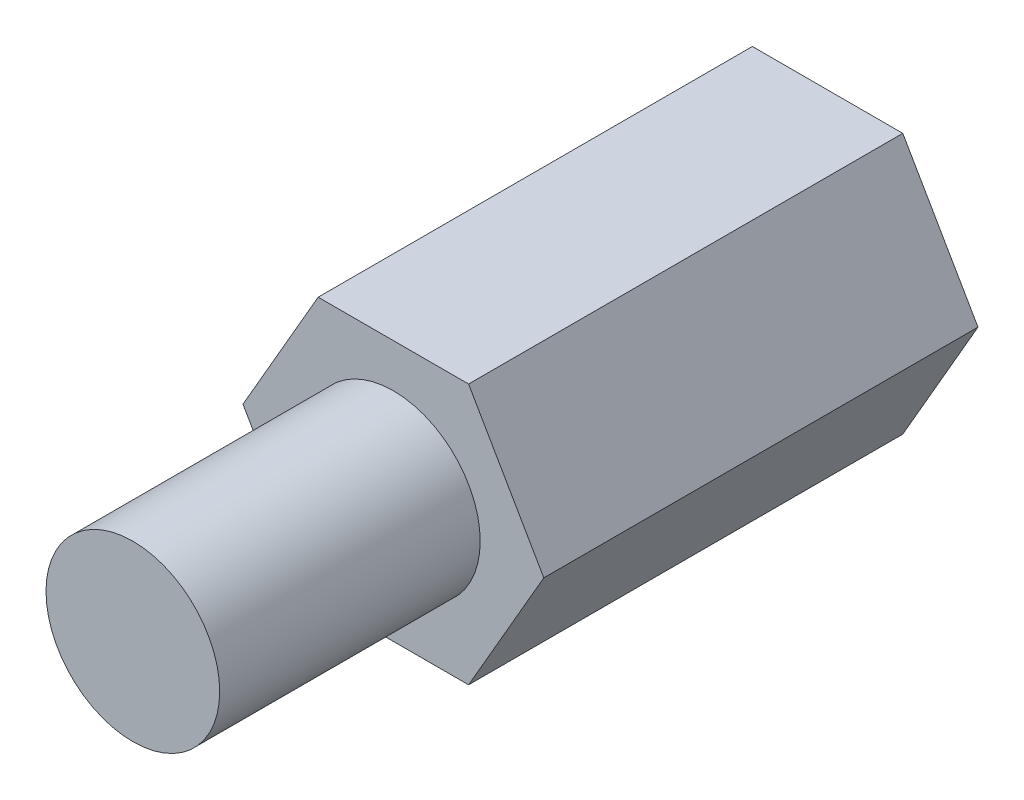
ISO-10303-21;
HEADER;
FILE_DESCRIPTION(('STEP AP214'),'2;1');
FILE_NAME('part.step','',(''),(''),'','','');
FILE_SCHEMA(('AUTOMOTIVE_DESIGN { 1 0 10303 214 1 1 1 1 }'));
ENDSEC;
DATA;
#1=APPLICATION_CONTEXT('core data for automotive mechanical design processes');
#2=APPLICATION_PROTOCOL_DEFINITION('international standard','automotive_design',2000,#1);
#3=PRODUCT_CONTEXT('',#1,'mechanical');
#4=PRODUCT('Part','Part','',(#3));
#5=PRODUCT_RELATED_PRODUCT_CATEGORY('part','',(#4));
#6=PRODUCT_DEFINITION_FORMATION('','',#4);
#7=PRODUCT_DEFINITION_CONTEXT('part definition',#1,'design');
#8=PRODUCT_DEFINITION('design','',#6,#7);
#9=PRODUCT_DEFINITION_SHAPE('','',#8);
#10=(LENGTH_UNIT() NAMED_UNIT(*) SI_UNIT(.MILLI.,.METRE.));
#11=(NAMED_UNIT(*) PLANE_ANGLE_UNIT() SI_UNIT($,.RADIAN.));
#12=(NAMED_UNIT(*) SI_UNIT($,.STERADIAN.) SOLID_ANGLE_UNIT());
#13=UNCERTAINTY_MEASURE_WITH_UNIT(LENGTH_MEASURE(1.E-05),#10,'distance_accuracy_value','');
#14=(GEOMETRIC_REPRESENTATION_CONTEXT(3) GLOBAL_UNCERTAINTY_ASSIGNED_CONTEXT((#13)) GLOBAL_UNIT_ASSIGNED_CONTEXT((#10,
#11,#12)) REPRESENTATION_CONTEXT('',''));
#15=CARTESIAN_POINT('',(0.,0.,0.));
#16=DIRECTION('',(0.,0.,1.));
#17=DIRECTION('',(1.,0.,0.));
#18=AXIS2_PLACEMENT_3D('',#15,#16,#17);
#19=CARTESIAN_POINT('',(-0.866025403784438,-1.5,5.));
#20=DIRECTION('',(0.,1.,0.));
#21=DIRECTION('',(-1.,0.,0.));
#22=AXIS2_PLACEMENT_3D('',#19,#20,#21);
#23=PLANE('',#22);
#24=DIRECTION('',(1.,0.,0.));
#25=VECTOR('',#24,1.);
#26=CARTESIAN_POINT('',(-0.866025403784438,-1.5,0.));
#27=LINE('',#26,#25);
#28=CARTESIAN_POINT('',(-0.866025403784438,-1.5,0.));
#29=VERTEX_POINT('',#28);
#30=CARTESIAN_POINT('',(0.866025403784439,-1.5,0.));
#31=VERTEX_POINT('',#30);
#32=EDGE_CURVE('E121',#29,#31,#27,.T.);
#33=ORIENTED_EDGE('',*,*,#32,.T.);
#34=DIRECTION('',(0.,0.,-1.));
#35=VECTOR('',#34,1.);
#36=CARTESIAN_POINT('',(0.866025403784439,-1.5,5.));
#37=LINE('',#36,#35);
#38=CARTESIAN_POINT('',(0.866025403784439,-1.5,5.));
#39=VERTEX_POINT('',#38);
#40=EDGE_CURVE('E36',#39,#31,#37,.T.);
#41=ORIENTED_EDGE('',*,*,#40,.F.);
#42=DIRECTION('',(1.,0.,0.));
#43=VECTOR('',#42,1.);
#44=CARTESIAN_POINT('',(-0.866025403784438,-1.5,5.));
#45=LINE('',#44,#43);
#46=CARTESIAN_POINT('',(-0.866025403784438,-1.5,5.));
#47=VERTEX_POINT('',#46);
#48=EDGE_CURVE('E132',#47,#39,#45,.T.);
#49=ORIENTED_EDGE('',*,*,#48,.F.);
#50=DIRECTION('',(0.,0.,-1.));
#51=VECTOR('',#50,1.);
#52=CARTESIAN_POINT('',(-0.866025403784438,-1.5,5.));
#53=LINE('',#52,#51);
#54=EDGE_CURVE('E117',#47,#29,#53,.T.);
#55=ORIENTED_EDGE('',*,*,#54,.T.);
#56=EDGE_LOOP('',(#33,#41,#49,#55));
#57=FACE_BOUND('',#56,.T.);
#58=ADVANCED_FACE('F33',(#57),#23,.F.);
#59=CARTESIAN_POINT('',(0.866025403784439,-1.5,5.));
#60=DIRECTION('',(-0.866025403784439,0.5,0.));
#61=DIRECTION('',(-0.5,-0.866025403784439,0.));
#62=AXIS2_PLACEMENT_3D('',#59,#60,#61);
#63=PLANE('',#62);
#64=DIRECTION('',(0.5,0.866025403784439,0.));
#65=VECTOR('',#64,1.);
#66=CARTESIAN_POINT('',(0.866025403784439,-1.5,0.));
#67=LINE('',#66,#65);
#68=CARTESIAN_POINT('',(1.73205080756888,0.,0.));
#69=VERTEX_POINT('',#68);
#70=EDGE_CURVE('E124',#31,#69,#67,.T.);
#71=ORIENTED_EDGE('',*,*,#70,.T.);
#72=DIRECTION('',(0.,0.,-1.));
#73=VECTOR('',#72,1.);
#74=CARTESIAN_POINT('',(1.73205080756888,0.,5.));
#75=LINE('',#74,#73);
#76=CARTESIAN_POINT('',(1.73205080756888,0.,5.));
#77=VERTEX_POINT('',#76);
#78=EDGE_CURVE('E135',#77,#69,#75,.T.);
#79=ORIENTED_EDGE('',*,*,#78,.F.);
#80=DIRECTION('',(0.5,0.866025403784439,0.));
#81=VECTOR('',#80,1.);
#82=CARTESIAN_POINT('',(0.866025403784439,-1.5,5.));
#83=LINE('',#82,#81);
#84=EDGE_CURVE('E89',#39,#77,#83,.T.);
#85=ORIENTED_EDGE('',*,*,#84,.F.);
#86=ORIENTED_EDGE('',*,*,#40,.T.);
#87=EDGE_LOOP('',(#71,#79,#85,#86));
#88=FACE_BOUND('',#87,.T.);
#89=ADVANCED_FACE('F140',(#88),#63,.F.);
#90=CARTESIAN_POINT('',(1.73205080756888,0.,5.));
#91=DIRECTION('',(-0.866025403784439,-0.5,0.));
#92=DIRECTION('',(0.5,-0.866025403784439,0.));
#93=AXIS2_PLACEMENT_3D('',#90,#91,#92);
#94=PLANE('',#93);
#95=DIRECTION('',(-0.5,0.866025403784439,0.));
#96=VECTOR('',#95,1.);
#97=CARTESIAN_POINT('',(1.73205080756888,0.,0.));
#98=LINE('',#97,#96);
#99=CARTESIAN_POINT('',(0.866025403784439,1.5,0.));
#100=VERTEX_POINT('',#99);
#101=EDGE_CURVE('E127',#69,#100,#98,.T.);
#102=ORIENTED_EDGE('',*,*,#101,.T.);
#103=DIRECTION('',(0.,0.,-1.));
#104=VECTOR('',#103,1.);
#105=CARTESIAN_POINT('',(0.866025403784439,1.5,5.));
#106=LINE('',#105,#104);
#107=CARTESIAN_POINT('',(0.866025403784439,1.5,5.));
#108=VERTEX_POINT('',#107);
#109=EDGE_CURVE('E112',#108,#100,#106,.T.);
#110=ORIENTED_EDGE('',*,*,#109,.F.);
#111=DIRECTION('',(-0.5,0.866025403784439,0.));
#112=VECTOR('',#111,1.);
#113=CARTESIAN_POINT('',(1.73205080756888,0.,5.));
#114=LINE('',#113,#112);
#115=EDGE_CURVE('E103',#77,#108,#114,.T.);
#116=ORIENTED_EDGE('',*,*,#115,.F.);
#117=ORIENTED_EDGE('',*,*,#78,.T.);
#118=EDGE_LOOP('',(#102,#110,#116,#117));
#119=FACE_BOUND('',#118,.T.);
#120=ADVANCED_FACE('F146',(#119),#94,.F.);
#121=CARTESIAN_POINT('',(0.866025403784439,1.5,5.));
#122=DIRECTION('',(0.,-1.,0.));
#123=DIRECTION('',(0.,0.,-1.));
#124=AXIS2_PLACEMENT_3D('',#121,#122,#123);
#125=PLANE('',#124);
#126=DIRECTION('',(-1.,0.,0.));
#127=VECTOR('',#126,1.);
#128=CARTESIAN_POINT('',(0.866025403784439,1.5,0.));
#129=LINE('',#128,#127);
#130=CARTESIAN_POINT('',(-0.866025403784439,1.5,0.));
#131=VERTEX_POINT('',#130);
#132=EDGE_CURVE('E111',#100,#131,#129,.T.);
#133=ORIENTED_EDGE('',*,*,#132,.T.);
#134=DIRECTION('',(0.,0.,-1.));
#135=VECTOR('',#134,1.);
#136=CARTESIAN_POINT('',(-0.866025403784439,1.5,5.));
#137=LINE('',#136,#135);
#138=CARTESIAN_POINT('',(-0.866025403784439,1.5,5.));
#139=VERTEX_POINT('',#138);
#140=EDGE_CURVE('E108',#139,#131,#137,.T.);
#141=ORIENTED_EDGE('',*,*,#140,.F.);
#142=DIRECTION('',(-1.,0.,0.));
#143=VECTOR('',#142,1.);
#144=CARTESIAN_POINT('',(0.866025403784439,1.5,5.));
#145=LINE('',#144,#143);
#146=EDGE_CURVE('E97',#108,#139,#145,.T.);
#147=ORIENTED_EDGE('',*,*,#146,.F.);
#148=ORIENTED_EDGE('',*,*,#109,.T.);
#149=EDGE_LOOP('',(#133,#141,#147,#148));
#150=FACE_BOUND('',#149,.T.);
#151=ADVANCED_FACE('F109',(#150),#125,.F.);
#152=CARTESIAN_POINT('',(-0.866025403784439,1.5,5.));
#153=DIRECTION('',(0.866025403784439,-0.5,0.));
#154=DIRECTION('',(0.5,0.866025403784439,0.));
#155=AXIS2_PLACEMENT_3D('',#152,#153,#154);
#156=PLANE('',#155);
#157=DIRECTION('',(-0.5,-0.866025403784439,0.));
#158=VECTOR('',#157,1.);
#159=CARTESIAN_POINT('',(-0.866025403784439,1.5,0.));
#160=LINE('',#159,#158);
#161=CARTESIAN_POINT('',(-1.73205080756888,0.,0.));
#162=VERTEX_POINT('',#161);
#163=EDGE_CURVE('E74',#131,#162,#160,.T.);
#164=ORIENTED_EDGE('',*,*,#163,.T.);
#165=DIRECTION('',(0.,0.,-1.));
#166=VECTOR('',#165,1.);
#167=CARTESIAN_POINT('',(-1.73205080756888,0.,5.));
#168=LINE('',#167,#166);
#169=CARTESIAN_POINT('',(-1.73205080756888,0.,5.));
#170=VERTEX_POINT('',#169);
#171=EDGE_CURVE('E113',#170,#162,#168,.T.);
#172=ORIENTED_EDGE('',*,*,#171,.F.);
#173=DIRECTION('',(-0.5,-0.866025403784439,0.));
#174=VECTOR('',#173,1.);
#175=CARTESIAN_POINT('',(-0.866025403784439,1.5,5.));
#176=LINE('',#175,#174);
#177=EDGE_CURVE('E101',#139,#170,#176,.T.);
#178=ORIENTED_EDGE('',*,*,#177,.F.);
#179=ORIENTED_EDGE('',*,*,#140,.T.);
#180=EDGE_LOOP('',(#164,#172,#178,#179));
#181=FACE_BOUND('',#180,.T.);
#182=ADVANCED_FACE('F115',(#181),#156,.F.);
#183=CARTESIAN_POINT('',(-1.73205080756888,0.,5.));
#184=DIRECTION('',(0.866025403784439,0.5,0.));
#185=DIRECTION('',(-0.5,0.866025403784439,0.));
#186=AXIS2_PLACEMENT_3D('',#183,#184,#185);
#187=PLANE('',#186);
#188=DIRECTION('',(0.5,-0.866025403784439,0.));
#189=VECTOR('',#188,1.);
#190=CARTESIAN_POINT('',(-1.73205080756888,0.,0.));
#191=LINE('',#190,#189);
#192=EDGE_CURVE('E80',#162,#29,#191,.T.);
#193=ORIENTED_EDGE('',*,*,#192,.T.);
#194=ORIENTED_EDGE('',*,*,#54,.F.);
#195=DIRECTION('',(0.5,-0.866025403784439,0.));
#196=VECTOR('',#195,1.);
#197=CARTESIAN_POINT('',(-1.73205080756888,0.,5.));
#198=LINE('',#197,#196);
#199=EDGE_CURVE('E50',#170,#47,#198,.T.);
#200=ORIENTED_EDGE('',*,*,#199,.F.);
#201=ORIENTED_EDGE('',*,*,#171,.T.);
#202=EDGE_LOOP('',(#193,#194,#200,#201));
#203=FACE_BOUND('',#202,.T.);
#204=ADVANCED_FACE('F171',(#203),#187,.F.);
#205=CARTESIAN_POINT('',(0.,0.,5.));
#206=DIRECTION('',(0.,0.,1.));
#207=DIRECTION('',(1.,0.,0.));
#208=AXIS2_PLACEMENT_3D('',#205,#206,#207);
#209=PLANE('',#208);
#210=CARTESIAN_POINT('',(0.,0.,5.));
#211=DIRECTION('',(0.,0.,1.));
#212=DIRECTION('',(1.,0.,0.));
#213=AXIS2_PLACEMENT_3D('',#210,#211,#212);
#214=CIRCLE('',#213,1.);
#215=CARTESIAN_POINT('',(1.,0.,5.));
#216=VERTEX_POINT('',#215);
#217=EDGE_CURVE('E11',#216,#216,#214,.T.);
#218=ORIENTED_EDGE('',*,*,#217,.F.);
#219=EDGE_LOOP('',(#218));
#220=FACE_BOUND('',#219,.T.);
#221=ORIENTED_EDGE('',*,*,#48,.T.);
#222=ORIENTED_EDGE('',*,*,#84,.T.);
#223=ORIENTED_EDGE('',*,*,#115,.T.);
#224=ORIENTED_EDGE('',*,*,#146,.T.);
#225=ORIENTED_EDGE('',*,*,#177,.T.);
#226=ORIENTED_EDGE('',*,*,#199,.T.);
#227=EDGE_LOOP('',(#221,#222,#223,#224,#225,#226));
#228=FACE_BOUND('',#227,.T.);
#229=ADVANCED_FACE('F99',(#220,#228),#209,.T.);
#230=CARTESIAN_POINT('',(0.,0.,0.));
#231=DIRECTION('',(0.,0.,1.));
#232=DIRECTION('',(1.,0.,0.));
#233=AXIS2_PLACEMENT_3D('',#230,#231,#232);
#234=PLANE('',#233);
#235=CARTESIAN_POINT('',(0.,0.,0.));
#236=DIRECTION('',(0.,0.,-1.));
#237=DIRECTION('',(-1.,0.,0.));
#238=AXIS2_PLACEMENT_3D('',#235,#236,#237);
#239=CIRCLE('',#238,1.19999999999999);
#240=CARTESIAN_POINT('',(-1.19999999999999,0.,0.));
#241=VERTEX_POINT('',#240);
#242=EDGE_CURVE('E155',#241,#241,#239,.T.);
#243=ORIENTED_EDGE('',*,*,#242,.F.);
#244=EDGE_LOOP('',(#243));
#245=FACE_BOUND('',#244,.T.);
#246=ORIENTED_EDGE('',*,*,#32,.F.);
#247=ORIENTED_EDGE('',*,*,#192,.F.);
#248=ORIENTED_EDGE('',*,*,#163,.F.);
#249=ORIENTED_EDGE('',*,*,#132,.F.);
#250=ORIENTED_EDGE('',*,*,#101,.F.);
#251=ORIENTED_EDGE('',*,*,#70,.F.);
#252=EDGE_LOOP('',(#246,#247,#248,#249,#250,#251));
#253=FACE_BOUND('',#252,.T.);
#254=ADVANCED_FACE('F145',(#245,#253),#234,.F.);
#255=CARTESIAN_POINT('',(0.,0.,8.));
#256=DIRECTION('',(0.,0.,-1.));
#257=DIRECTION('',(-1.,0.,0.));
#258=AXIS2_PLACEMENT_3D('',#255,#256,#257);
#259=CYLINDRICAL_SURFACE('',#258,1.);
#260=CARTESIAN_POINT('',(0.,0.,8.));
#261=DIRECTION('',(0.,0.,1.));
#262=DIRECTION('',(1.,0.,0.));
#263=AXIS2_PLACEMENT_3D('',#260,#261,#262);
#264=CIRCLE('',#263,1.);
#265=CARTESIAN_POINT('',(1.,0.,8.));
#266=VERTEX_POINT('',#265);
#267=EDGE_CURVE('E125',#266,#266,#264,.T.);
#268=ORIENTED_EDGE('',*,*,#267,.F.);
#269=EDGE_LOOP('',(#268));
#270=FACE_BOUND('',#269,.T.);
#271=ORIENTED_EDGE('',*,*,#217,.T.);
#272=EDGE_LOOP('',(#271));
#273=FACE_BOUND('',#272,.T.);
#274=ADVANCED_FACE('F162',(#270,#273),#259,.T.);
#275=CARTESIAN_POINT('',(0.,0.,8.));
#276=DIRECTION('',(0.,0.,1.));
#277=DIRECTION('',(1.,0.,0.));
#278=AXIS2_PLACEMENT_3D('',#275,#276,#277);
#279=PLANE('',#278);
#280=ORIENTED_EDGE('',*,*,#267,.T.);
#281=EDGE_LOOP('',(#280));
#282=FACE_BOUND('',#281,.T.);
#283=ADVANCED_FACE('F168',(#282),#279,.T.);
#284=CARTESIAN_POINT('',(0.,0.,3.));
#285=DIRECTION('',(0.,0.,-1.));
#286=DIRECTION('',(-1.,0.,0.));
#287=AXIS2_PLACEMENT_3D('',#284,#285,#286);
#288=CONICAL_SURFACE('',#287,1.2,1.02974425867665);
#289=CARTESIAN_POINT('',(0.,0.,3.72103274283307));
#290=VERTEX_POINT('',#289);
#291=VERTEX_LOOP('',#290);
#292=FACE_BOUND('',#291,.T.);
#293=CARTESIAN_POINT('',(0.,0.,3.));
#294=DIRECTION('',(0.,0.,-1.));
#295=DIRECTION('',(-1.,0.,0.));
#296=AXIS2_PLACEMENT_3D('',#293,#294,#295);
#297=CIRCLE('',#296,1.2);
#298=CARTESIAN_POINT('',(-1.2,0.,3.));
#299=VERTEX_POINT('',#298);
#300=EDGE_CURVE('E152',#299,#299,#297,.T.);
#301=ORIENTED_EDGE('',*,*,#300,.T.);
#302=EDGE_LOOP('',(#301));
#303=FACE_BOUND('',#302,.T.);
#304=ADVANCED_FACE('F211',(#292,#303),#288,.F.);
#305=CARTESIAN_POINT('',(0.,0.,0.));
#306=DIRECTION('',(0.,0.,-1.));
#307=DIRECTION('',(-1.,0.,0.));
#308=AXIS2_PLACEMENT_3D('',#305,#306,#307);
#309=CYLINDRICAL_SURFACE('',#308,1.19999999999999);
#310=ORIENTED_EDGE('',*,*,#300,.F.);
#311=EDGE_LOOP('',(#310));
#312=FACE_BOUND('',#311,.T.);
#313=ORIENTED_EDGE('',*,*,#242,.T.);
#314=EDGE_LOOP('',(#313));
#315=FACE_BOUND('',#314,.T.);
#316=ADVANCED_FACE('F159',(#312,#315),#309,.F.);
#317=CLOSED_SHELL('',(#58,#89,#120,#151,#182,#204,#229,#254,#274,#283,#304,#316));
#318=MANIFOLD_SOLID_BREP('B2',#317);
#319=ADVANCED_BREP_SHAPE_REPRESENTATION('',(#18,#318),#14);
#320=SHAPE_DEFINITION_REPRESENTATION(#9,#319);
ENDSEC;
END-ISO-10303-21;
